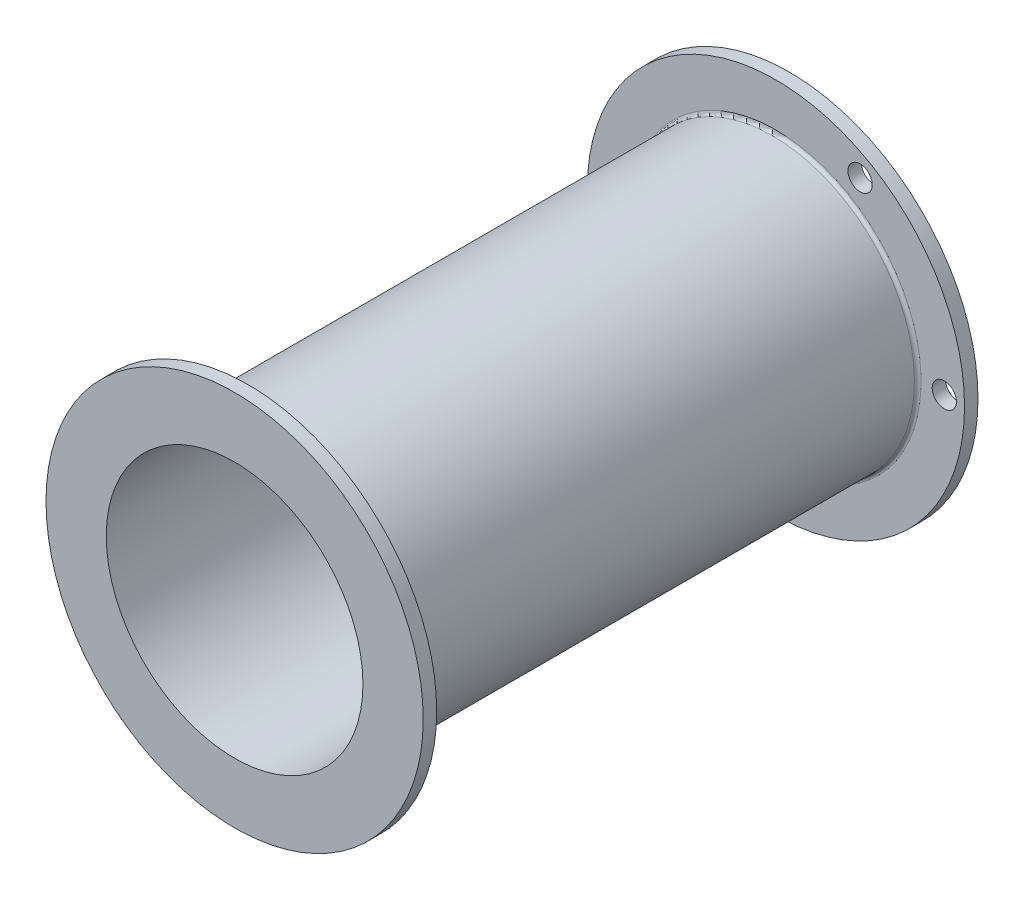
ISO-10303-21;
HEADER;
FILE_DESCRIPTION(('STEP AP214'),'2;1');
FILE_NAME('part.step','',(''),(''),'','','');
FILE_SCHEMA(('AUTOMOTIVE_DESIGN { 1 0 10303 214 1 1 1 1 }'));
ENDSEC;
DATA;
#1=APPLICATION_CONTEXT('core data for automotive mechanical design processes');
#2=APPLICATION_PROTOCOL_DEFINITION('international standard','automotive_design',2000,#1);
#3=PRODUCT_CONTEXT('',#1,'mechanical');
#4=PRODUCT('Part','Part','',(#3));
#5=PRODUCT_RELATED_PRODUCT_CATEGORY('part','',(#4));
#6=PRODUCT_DEFINITION_FORMATION('','',#4);
#7=PRODUCT_DEFINITION_CONTEXT('part definition',#1,'design');
#8=PRODUCT_DEFINITION('design','',#6,#7);
#9=PRODUCT_DEFINITION_SHAPE('','',#8);
#10=(LENGTH_UNIT() NAMED_UNIT(*) SI_UNIT(.MILLI.,.METRE.));
#11=(NAMED_UNIT(*) PLANE_ANGLE_UNIT() SI_UNIT($,.RADIAN.));
#12=(NAMED_UNIT(*) SI_UNIT($,.STERADIAN.) SOLID_ANGLE_UNIT());
#13=UNCERTAINTY_MEASURE_WITH_UNIT(LENGTH_MEASURE(1.E-05),#10,'distance_accuracy_value','');
#14=(GEOMETRIC_REPRESENTATION_CONTEXT(3) GLOBAL_UNCERTAINTY_ASSIGNED_CONTEXT((#13)) GLOBAL_UNIT_ASSIGNED_CONTEXT((#10,
#11,#12)) REPRESENTATION_CONTEXT('',''));
#15=CARTESIAN_POINT('',(0.,0.,0.));
#16=DIRECTION('',(0.,0.,1.));
#17=DIRECTION('',(1.,0.,0.));
#18=AXIS2_PLACEMENT_3D('',#15,#16,#17);
#19=CARTESIAN_POINT('',(0.,0.,40.18));
#20=DIRECTION('',(0.,0.,-1.));
#21=DIRECTION('',(-1.,0.,0.));
#22=AXIS2_PLACEMENT_3D('',#19,#20,#21);
#23=CYLINDRICAL_SURFACE('',#22,10.525);
#24=CARTESIAN_POINT('',(0.,0.,0.25));
#25=DIRECTION('',(0.,0.,-1.));
#26=DIRECTION('',(-1.,0.,0.));
#27=AXIS2_PLACEMENT_3D('',#24,#25,#26);
#28=CIRCLE('',#27,10.525);
#29=CARTESIAN_POINT('',(-10.525,0.,0.25));
#30=VERTEX_POINT('',#29);
#31=EDGE_CURVE('E46',#30,#30,#28,.F.);
#32=ORIENTED_EDGE('',*,*,#31,.T.);
#33=EDGE_LOOP('',(#32));
#34=FACE_BOUND('',#33,.T.);
#35=CARTESIAN_POINT('',(0.,0.,39.18));
#36=DIRECTION('',(0.,0.,1.));
#37=DIRECTION('',(1.,0.,0.));
#38=AXIS2_PLACEMENT_3D('',#35,#36,#37);
#39=CIRCLE('',#38,10.525);
#40=CARTESIAN_POINT('',(10.525,0.,39.18));
#41=VERTEX_POINT('',#40);
#42=EDGE_CURVE('E10',#41,#41,#39,.T.);
#43=ORIENTED_EDGE('',*,*,#42,.F.);
#44=EDGE_LOOP('',(#43));
#45=FACE_BOUND('',#44,.T.);
#46=ADVANCED_FACE('F34',(#34,#45),#23,.T.);
#47=CARTESIAN_POINT('',(0.,0.,40.18));
#48=DIRECTION('',(0.,0.,1.));
#49=DIRECTION('',(1.,0.,0.));
#50=AXIS2_PLACEMENT_3D('',#47,#48,#49);
#51=PLANE('',#50);
#52=CARTESIAN_POINT('',(0.,0.,40.18));
#53=DIRECTION('',(0.,0.,1.));
#54=DIRECTION('',(1.,0.,0.));
#55=AXIS2_PLACEMENT_3D('',#52,#53,#54);
#56=CIRCLE('',#55,9.525);
#57=CARTESIAN_POINT('',(9.525,0.,40.18));
#58=VERTEX_POINT('',#57);
#59=EDGE_CURVE('E83',#58,#58,#56,.T.);
#60=ORIENTED_EDGE('',*,*,#59,.F.);
#61=EDGE_LOOP('',(#60));
#62=FACE_BOUND('',#61,.T.);
#63=CARTESIAN_POINT('',(0.,0.,40.18));
#64=DIRECTION('',(0.,0.,-1.));
#65=DIRECTION('',(-1.,0.,0.));
#66=AXIS2_PLACEMENT_3D('',#63,#64,#65);
#67=CIRCLE('',#66,14.);
#68=CARTESIAN_POINT('',(-14.,0.,40.18));
#69=VERTEX_POINT('',#68);
#70=EDGE_CURVE('E68',#69,#69,#67,.T.);
#71=ORIENTED_EDGE('',*,*,#70,.F.);
#72=EDGE_LOOP('',(#71));
#73=FACE_BOUND('',#72,.T.);
#74=ADVANCED_FACE('F108',(#62,#73),#51,.T.);
#75=CARTESIAN_POINT('',(0.,0.,40.18));
#76=DIRECTION('',(0.,0.,-1.));
#77=DIRECTION('',(-1.,0.,0.));
#78=AXIS2_PLACEMENT_3D('',#75,#76,#77);
#79=CYLINDRICAL_SURFACE('',#78,9.525);
#80=ORIENTED_EDGE('',*,*,#59,.T.);
#81=EDGE_LOOP('',(#80));
#82=FACE_BOUND('',#81,.T.);
#83=CARTESIAN_POINT('',(0.,0.,-1.));
#84=DIRECTION('',(0.,0.,-1.));
#85=DIRECTION('',(-1.,0.,0.));
#86=AXIS2_PLACEMENT_3D('',#83,#84,#85);
#87=CIRCLE('',#86,9.525);
#88=CARTESIAN_POINT('',(-9.525,0.,-1.));
#89=VERTEX_POINT('',#88);
#90=EDGE_CURVE('E76',#89,#89,#87,.T.);
#91=ORIENTED_EDGE('',*,*,#90,.T.);
#92=EDGE_LOOP('',(#91));
#93=FACE_BOUND('',#92,.T.);
#94=ADVANCED_FACE('F112',(#82,#93),#79,.F.);
#95=CARTESIAN_POINT('',(0.,0.,-1.));
#96=DIRECTION('',(0.,0.,-1.));
#97=DIRECTION('',(-1.,0.,0.));
#98=AXIS2_PLACEMENT_3D('',#95,#96,#97);
#99=PLANE('',#98);
#100=CARTESIAN_POINT('',(6.25000000000005,10.8253175473055,-1.));
#101=DIRECTION('',(0.,0.,-1.));
#102=DIRECTION('',(0.500000000000004,0.866025403784436,0.));
#103=AXIS2_PLACEMENT_3D('',#100,#101,#102);
#104=CIRCLE('',#103,0.899999999999999);
#105=CARTESIAN_POINT('',(6.70000000000006,11.6047404107115,-1.));
#106=VERTEX_POINT('',#105);
#107=EDGE_CURVE('E51',#106,#106,#104,.T.);
#108=ORIENTED_EDGE('',*,*,#107,.F.);
#109=EDGE_LOOP('',(#108));
#110=FACE_BOUND('',#109,.T.);
#111=CARTESIAN_POINT('',(12.5,0.,-1.));
#112=DIRECTION('',(0.,0.,-1.));
#113=DIRECTION('',(1.,0.,0.));
#114=AXIS2_PLACEMENT_3D('',#111,#112,#113);
#115=CIRCLE('',#114,0.899999999999999);
#116=CARTESIAN_POINT('',(13.4,0.,-1.));
#117=VERTEX_POINT('',#116);
#118=EDGE_CURVE('E59',#117,#117,#115,.T.);
#119=ORIENTED_EDGE('',*,*,#118,.F.);
#120=EDGE_LOOP('',(#119));
#121=FACE_BOUND('',#120,.T.);
#122=CARTESIAN_POINT('',(-6.25000000000013,-10.8253175473054,-1.));
#123=DIRECTION('',(0.,0.,-1.));
#124=DIRECTION('',(-0.50000000000001,-0.866025403784433,0.));
#125=AXIS2_PLACEMENT_3D('',#122,#123,#124);
#126=CIRCLE('',#125,0.899999999999999);
#127=CARTESIAN_POINT('',(-6.70000000000014,-11.6047404107114,-1.));
#128=VERTEX_POINT('',#127);
#129=EDGE_CURVE('E65',#128,#128,#126,.T.);
#130=ORIENTED_EDGE('',*,*,#129,.F.);
#131=EDGE_LOOP('',(#130));
#132=FACE_BOUND('',#131,.T.);
#133=CARTESIAN_POINT('',(-12.5,0.,-1.));
#134=DIRECTION('',(0.,0.,-1.));
#135=DIRECTION('',(-1.,0.,0.));
#136=AXIS2_PLACEMENT_3D('',#133,#134,#135);
#137=CIRCLE('',#136,0.899999999999999);
#138=CARTESIAN_POINT('',(-13.4,0.,-1.));
#139=VERTEX_POINT('',#138);
#140=EDGE_CURVE('E73',#139,#139,#137,.T.);
#141=ORIENTED_EDGE('',*,*,#140,.F.);
#142=EDGE_LOOP('',(#141));
#143=FACE_BOUND('',#142,.T.);
#144=CARTESIAN_POINT('',(0.,0.,-1.));
#145=DIRECTION('',(0.,0.,-1.));
#146=DIRECTION('',(-1.,0.,0.));
#147=AXIS2_PLACEMENT_3D('',#144,#145,#146);
#148=CIRCLE('',#147,14.);
#149=CARTESIAN_POINT('',(-14.,0.,-1.));
#150=VERTEX_POINT('',#149);
#151=EDGE_CURVE('E80',#150,#150,#148,.T.);
#152=ORIENTED_EDGE('',*,*,#151,.T.);
#153=EDGE_LOOP('',(#152));
#154=FACE_BOUND('',#153,.T.);
#155=ORIENTED_EDGE('',*,*,#90,.F.);
#156=EDGE_LOOP('',(#155));
#157=FACE_BOUND('',#156,.T.);
#158=ADVANCED_FACE('F118',(#110,#121,#132,#143,#154,#157),#99,.T.);
#159=CARTESIAN_POINT('',(0.,0.,0.));
#160=DIRECTION('',(0.,0.,-1.));
#161=DIRECTION('',(-1.,0.,0.));
#162=AXIS2_PLACEMENT_3D('',#159,#160,#161);
#163=PLANE('',#162);
#164=CARTESIAN_POINT('',(0.,0.,0.));
#165=DIRECTION('',(0.,0.,-1.));
#166=DIRECTION('',(-1.,0.,0.));
#167=AXIS2_PLACEMENT_3D('',#164,#165,#166);
#168=CIRCLE('',#167,10.775);
#169=CARTESIAN_POINT('',(-10.775,0.,0.));
#170=VERTEX_POINT('',#169);
#171=EDGE_CURVE('E38',#170,#170,#168,.T.);
#172=ORIENTED_EDGE('',*,*,#171,.T.);
#173=EDGE_LOOP('',(#172));
#174=FACE_BOUND('',#173,.T.);
#175=CARTESIAN_POINT('',(6.25000000000005,10.8253175473055,0.));
#176=DIRECTION('',(0.,0.,1.));
#177=DIRECTION('',(-0.500000000000004,-0.866025403784436,0.));
#178=AXIS2_PLACEMENT_3D('',#175,#176,#177);
#179=CIRCLE('',#178,0.9);
#180=CARTESIAN_POINT('',(5.80000000000005,10.0458946838995,0.));
#181=VERTEX_POINT('',#180);
#182=EDGE_CURVE('E54',#181,#181,#179,.T.);
#183=ORIENTED_EDGE('',*,*,#182,.F.);
#184=EDGE_LOOP('',(#183));
#185=FACE_BOUND('',#184,.T.);
#186=CARTESIAN_POINT('',(12.5,0.,0.));
#187=DIRECTION('',(0.,0.,1.));
#188=DIRECTION('',(-1.,0.,0.));
#189=AXIS2_PLACEMENT_3D('',#186,#187,#188);
#190=CIRCLE('',#189,0.9);
#191=CARTESIAN_POINT('',(11.6,0.,0.));
#192=VERTEX_POINT('',#191);
#193=EDGE_CURVE('E55',#192,#192,#190,.T.);
#194=ORIENTED_EDGE('',*,*,#193,.F.);
#195=EDGE_LOOP('',(#194));
#196=FACE_BOUND('',#195,.T.);
#197=CARTESIAN_POINT('',(-6.25000000000013,-10.8253175473054,0.));
#198=DIRECTION('',(0.,0.,1.));
#199=DIRECTION('',(0.50000000000001,0.866025403784433,0.));
#200=AXIS2_PLACEMENT_3D('',#197,#198,#199);
#201=CIRCLE('',#200,0.9);
#202=CARTESIAN_POINT('',(-5.80000000000012,-10.0458946838994,0.));
#203=VERTEX_POINT('',#202);
#204=EDGE_CURVE('E62',#203,#203,#201,.T.);
#205=ORIENTED_EDGE('',*,*,#204,.F.);
#206=EDGE_LOOP('',(#205));
#207=FACE_BOUND('',#206,.T.);
#208=CARTESIAN_POINT('',(-12.5,0.,0.));
#209=DIRECTION('',(0.,0.,1.));
#210=DIRECTION('',(1.,0.,0.));
#211=AXIS2_PLACEMENT_3D('',#208,#209,#210);
#212=CIRCLE('',#211,0.9);
#213=CARTESIAN_POINT('',(-11.6,0.,0.));
#214=VERTEX_POINT('',#213);
#215=EDGE_CURVE('E58',#214,#214,#212,.T.);
#216=ORIENTED_EDGE('',*,*,#215,.F.);
#217=EDGE_LOOP('',(#216));
#218=FACE_BOUND('',#217,.T.);
#219=CARTESIAN_POINT('',(0.,0.,0.));
#220=DIRECTION('',(0.,0.,-1.));
#221=DIRECTION('',(-1.,0.,0.));
#222=AXIS2_PLACEMENT_3D('',#219,#220,#221);
#223=CIRCLE('',#222,14.);
#224=CARTESIAN_POINT('',(-14.,0.,0.));
#225=VERTEX_POINT('',#224);
#226=EDGE_CURVE('E79',#225,#225,#223,.T.);
#227=ORIENTED_EDGE('',*,*,#226,.F.);
#228=EDGE_LOOP('',(#227));
#229=FACE_BOUND('',#228,.T.);
#230=ADVANCED_FACE('F124',(#174,#185,#196,#207,#218,#229),#163,.F.);
#231=CARTESIAN_POINT('',(0.,0.,-1.));
#232=DIRECTION('',(0.,0.,1.));
#233=DIRECTION('',(1.,0.,0.));
#234=AXIS2_PLACEMENT_3D('',#231,#232,#233);
#235=CYLINDRICAL_SURFACE('',#234,14.);
#236=ORIENTED_EDGE('',*,*,#151,.F.);
#237=EDGE_LOOP('',(#236));
#238=FACE_BOUND('',#237,.T.);
#239=ORIENTED_EDGE('',*,*,#226,.T.);
#240=EDGE_LOOP('',(#239));
#241=FACE_BOUND('',#240,.T.);
#242=ADVANCED_FACE('F120',(#238,#241),#235,.T.);
#243=CARTESIAN_POINT('',(-12.5,0.,0.));
#244=DIRECTION('',(0.,0.,1.));
#245=DIRECTION('',(1.,0.,0.));
#246=AXIS2_PLACEMENT_3D('',#243,#244,#245);
#247=CYLINDRICAL_SURFACE('',#246,0.899999999999999);
#248=ORIENTED_EDGE('',*,*,#140,.T.);
#249=EDGE_LOOP('',(#248));
#250=FACE_BOUND('',#249,.T.);
#251=ORIENTED_EDGE('',*,*,#215,.T.);
#252=EDGE_LOOP('',(#251));
#253=FACE_BOUND('',#252,.T.);
#254=ADVANCED_FACE('F123',(#250,#253),#247,.F.);
#255=CARTESIAN_POINT('',(-6.25000000000013,-10.8253175473054,0.));
#256=DIRECTION('',(0.,0.,1.));
#257=DIRECTION('',(0.50000000000001,0.866025403784433,0.));
#258=AXIS2_PLACEMENT_3D('',#255,#256,#257);
#259=CYLINDRICAL_SURFACE('',#258,0.899999999999999);
#260=ORIENTED_EDGE('',*,*,#129,.T.);
#261=EDGE_LOOP('',(#260));
#262=FACE_BOUND('',#261,.T.);
#263=ORIENTED_EDGE('',*,*,#204,.T.);
#264=EDGE_LOOP('',(#263));
#265=FACE_BOUND('',#264,.T.);
#266=ADVANCED_FACE('F134',(#262,#265),#259,.F.);
#267=CARTESIAN_POINT('',(12.5,0.,0.));
#268=DIRECTION('',(0.,0.,1.));
#269=DIRECTION('',(-1.,0.,0.));
#270=AXIS2_PLACEMENT_3D('',#267,#268,#269);
#271=CYLINDRICAL_SURFACE('',#270,0.899999999999999);
#272=ORIENTED_EDGE('',*,*,#118,.T.);
#273=EDGE_LOOP('',(#272));
#274=FACE_BOUND('',#273,.T.);
#275=ORIENTED_EDGE('',*,*,#193,.T.);
#276=EDGE_LOOP('',(#275));
#277=FACE_BOUND('',#276,.T.);
#278=ADVANCED_FACE('F103',(#274,#277),#271,.F.);
#279=CARTESIAN_POINT('',(6.25000000000005,10.8253175473055,0.));
#280=DIRECTION('',(0.,0.,1.));
#281=DIRECTION('',(-0.500000000000004,-0.866025403784436,0.));
#282=AXIS2_PLACEMENT_3D('',#279,#280,#281);
#283=CYLINDRICAL_SURFACE('',#282,0.899999999999999);
#284=ORIENTED_EDGE('',*,*,#107,.T.);
#285=EDGE_LOOP('',(#284));
#286=FACE_BOUND('',#285,.T.);
#287=ORIENTED_EDGE('',*,*,#182,.T.);
#288=EDGE_LOOP('',(#287));
#289=FACE_BOUND('',#288,.T.);
#290=ADVANCED_FACE('F94',(#286,#289),#283,.F.);
#291=CARTESIAN_POINT('',(0.,0.,0.25));
#292=DIRECTION('',(0.,0.,-1.));
#293=DIRECTION('',(-1.,0.,0.));
#294=AXIS2_PLACEMENT_3D('',#291,#292,#293);
#295=TOROIDAL_SURFACE('',#294,10.775,0.25);
#296=ORIENTED_EDGE('',*,*,#171,.F.);
#297=EDGE_LOOP('',(#296));
#298=FACE_BOUND('',#297,.T.);
#299=ORIENTED_EDGE('',*,*,#31,.F.);
#300=EDGE_LOOP('',(#299));
#301=FACE_BOUND('',#300,.T.);
#302=ADVANCED_FACE('F36',(#298,#301),#295,.F.);
#303=CARTESIAN_POINT('',(0.,0.,39.18));
#304=DIRECTION('',(0.,0.,1.));
#305=DIRECTION('',(-1.,0.,0.));
#306=AXIS2_PLACEMENT_3D('',#303,#304,#305);
#307=PLANE('',#306);
#308=CARTESIAN_POINT('',(0.,0.,39.18));
#309=DIRECTION('',(0.,0.,-1.));
#310=DIRECTION('',(-1.,0.,0.));
#311=AXIS2_PLACEMENT_3D('',#308,#309,#310);
#312=CIRCLE('',#311,14.);
#313=CARTESIAN_POINT('',(-14.,0.,39.18));
#314=VERTEX_POINT('',#313);
#315=EDGE_CURVE('E49',#314,#314,#312,.T.);
#316=ORIENTED_EDGE('',*,*,#315,.T.);
#317=EDGE_LOOP('',(#316));
#318=FACE_BOUND('',#317,.T.);
#319=ORIENTED_EDGE('',*,*,#42,.T.);
#320=EDGE_LOOP('',(#319));
#321=FACE_BOUND('',#320,.T.);
#322=ADVANCED_FACE('F93',(#318,#321),#307,.F.);
#323=CARTESIAN_POINT('',(0.,0.,40.18));
#324=DIRECTION('',(0.,0.,-1.));
#325=DIRECTION('',(-1.,0.,0.));
#326=AXIS2_PLACEMENT_3D('',#323,#324,#325);
#327=CYLINDRICAL_SURFACE('',#326,14.);
#328=ORIENTED_EDGE('',*,*,#70,.T.);
#329=EDGE_LOOP('',(#328));
#330=FACE_BOUND('',#329,.T.);
#331=ORIENTED_EDGE('',*,*,#315,.F.);
#332=EDGE_LOOP('',(#331));
#333=FACE_BOUND('',#332,.T.);
#334=ADVANCED_FACE('F100',(#330,#333),#327,.T.);
#335=CLOSED_SHELL('',(#46,#74,#94,#158,#230,#242,#254,#266,#278,#290,#302,#322,#334));
#336=MANIFOLD_SOLID_BREP('B2',#335);
#337=ADVANCED_BREP_SHAPE_REPRESENTATION('',(#18,#336),#14);
#338=SHAPE_DEFINITION_REPRESENTATION(#9,#337);
ENDSEC;
END-ISO-10303-21;
